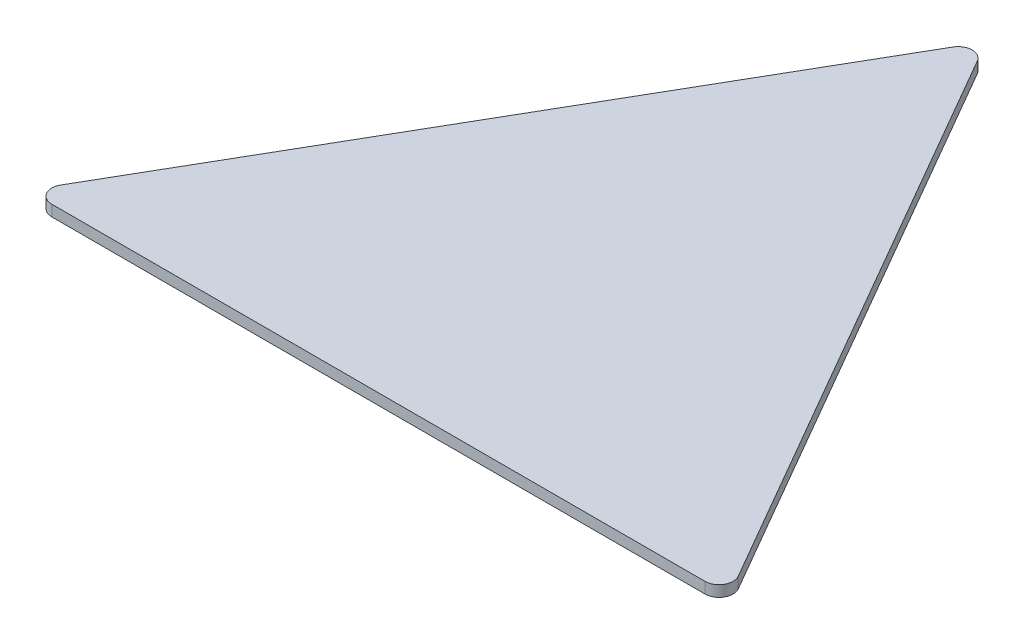
ISO-10303-21;
HEADER;
FILE_DESCRIPTION(('STEP AP214'),'2;1');
FILE_NAME('part.step','',(''),(''),'','','');
FILE_SCHEMA(('AUTOMOTIVE_DESIGN { 1 0 10303 214 1 1 1 1 }'));
ENDSEC;
DATA;
#1=APPLICATION_CONTEXT('core data for automotive mechanical design processes');
#2=APPLICATION_PROTOCOL_DEFINITION('international standard','automotive_design',2000,#1);
#3=PRODUCT_CONTEXT('',#1,'mechanical');
#4=PRODUCT('Part','Part','',(#3));
#5=PRODUCT_RELATED_PRODUCT_CATEGORY('part','',(#4));
#6=PRODUCT_DEFINITION_FORMATION('','',#4);
#7=PRODUCT_DEFINITION_CONTEXT('part definition',#1,'design');
#8=PRODUCT_DEFINITION('design','',#6,#7);
#9=PRODUCT_DEFINITION_SHAPE('','',#8);
#10=(LENGTH_UNIT() NAMED_UNIT(*) SI_UNIT(.MILLI.,.METRE.));
#11=(NAMED_UNIT(*) PLANE_ANGLE_UNIT() SI_UNIT($,.RADIAN.));
#12=(NAMED_UNIT(*) SI_UNIT($,.STERADIAN.) SOLID_ANGLE_UNIT());
#13=UNCERTAINTY_MEASURE_WITH_UNIT(LENGTH_MEASURE(1.E-05),#10,'distance_accuracy_value','');
#14=(GEOMETRIC_REPRESENTATION_CONTEXT(3) GLOBAL_UNCERTAINTY_ASSIGNED_CONTEXT((#13)) GLOBAL_UNIT_ASSIGNED_CONTEXT((#10,
#11,#12)) REPRESENTATION_CONTEXT('',''));
#15=CARTESIAN_POINT('',(0.,0.,0.));
#16=DIRECTION('',(0.,0.,1.));
#17=DIRECTION('',(1.,0.,0.));
#18=AXIS2_PLACEMENT_3D('',#15,#16,#17);
#19=CARTESIAN_POINT('',(127.,3.9878,73.3234841870824));
#20=DIRECTION('',(-0.866025403784439,0.,0.5));
#21=DIRECTION('',(0.5,0.,0.866025403784439));
#22=AXIS2_PLACEMENT_3D('',#19,#20,#21);
#23=PLANE('',#22);
#24=DIRECTION('',(-0.5,0.,-0.866025403784439));
#25=VECTOR('',#24,1.);
#26=CARTESIAN_POINT('',(127.,0.,73.3234841870824));
#27=LINE('',#26,#25);
#28=CARTESIAN_POINT('',(122.600590948775,0.,65.7034841870824));
#29=VERTEX_POINT('',#28);
#30=CARTESIAN_POINT('',(4.39940905122493,0.,-139.026968374165));
#31=VERTEX_POINT('',#30);
#32=EDGE_CURVE('E116',#29,#31,#27,.T.);
#33=ORIENTED_EDGE('',*,*,#32,.T.);
#34=DIRECTION('',(0.,-1.,0.));
#35=VECTOR('',#34,1.);
#36=CARTESIAN_POINT('',(4.39940905122495,3.9878,-139.026968374165));
#37=LINE('',#36,#35);
#38=CARTESIAN_POINT('',(4.39940905122493,3.9878,-139.026968374165));
#39=VERTEX_POINT('',#38);
#40=EDGE_CURVE('E11',#31,#39,#37,.F.);
#41=ORIENTED_EDGE('',*,*,#40,.T.);
#42=DIRECTION('',(-0.5,0.,-0.866025403784439));
#43=VECTOR('',#42,1.);
#44=CARTESIAN_POINT('',(127.,3.9878,73.3234841870824));
#45=LINE('',#44,#43);
#46=CARTESIAN_POINT('',(122.600590948775,3.9878,65.7034841870824));
#47=VERTEX_POINT('',#46);
#48=EDGE_CURVE('E111',#47,#39,#45,.T.);
#49=ORIENTED_EDGE('',*,*,#48,.F.);
#50=DIRECTION('',(0.,-1.,0.));
#51=VECTOR('',#50,1.);
#52=CARTESIAN_POINT('',(122.600590948775,3.9878,65.7034841870824));
#53=LINE('',#52,#51);
#54=EDGE_CURVE('E41',#47,#29,#53,.T.);
#55=ORIENTED_EDGE('',*,*,#54,.T.);
#56=EDGE_LOOP('',(#33,#41,#49,#55));
#57=FACE_BOUND('',#56,.T.);
#58=ADVANCED_FACE('F33',(#57),#23,.F.);
#59=CARTESIAN_POINT('',(0.,3.9878,-146.646968374165));
#60=DIRECTION('',(0.866025403784438,0.,0.5));
#61=DIRECTION('',(0.5,0.,-0.866025403784439));
#62=AXIS2_PLACEMENT_3D('',#59,#60,#61);
#63=PLANE('',#62);
#64=DIRECTION('',(-0.5,0.,0.866025403784439));
#65=VECTOR('',#64,1.);
#66=CARTESIAN_POINT('',(0.,0.,-146.646968374165));
#67=LINE('',#66,#65);
#68=CARTESIAN_POINT('',(-4.39940905122494,0.,-139.026968374165));
#69=VERTEX_POINT('',#68);
#70=CARTESIAN_POINT('',(-122.600590948775,0.,65.7034841870826));
#71=VERTEX_POINT('',#70);
#72=EDGE_CURVE('E112',#69,#71,#67,.T.);
#73=ORIENTED_EDGE('',*,*,#72,.T.);
#74=DIRECTION('',(0.,-1.,0.));
#75=VECTOR('',#74,1.);
#76=CARTESIAN_POINT('',(-122.600590948775,3.9878,65.7034841870825));
#77=LINE('',#76,#75);
#78=CARTESIAN_POINT('',(-122.600590948775,3.9878,65.7034841870826));
#79=VERTEX_POINT('',#78);
#80=EDGE_CURVE('E91',#71,#79,#77,.F.);
#81=ORIENTED_EDGE('',*,*,#80,.T.);
#82=DIRECTION('',(-0.5,0.,0.866025403784439));
#83=VECTOR('',#82,1.);
#84=CARTESIAN_POINT('',(0.,3.9878,-146.646968374165));
#85=LINE('',#84,#83);
#86=CARTESIAN_POINT('',(-4.39940905122494,3.9878,-139.026968374165));
#87=VERTEX_POINT('',#86);
#88=EDGE_CURVE('E114',#87,#79,#85,.T.);
#89=ORIENTED_EDGE('',*,*,#88,.F.);
#90=DIRECTION('',(0.,-1.,0.));
#91=VECTOR('',#90,1.);
#92=CARTESIAN_POINT('',(-4.39940905122494,3.9878,-139.026968374165));
#93=LINE('',#92,#91);
#94=EDGE_CURVE('E96',#87,#69,#93,.T.);
#95=ORIENTED_EDGE('',*,*,#94,.T.);
#96=EDGE_LOOP('',(#73,#81,#89,#95));
#97=FACE_BOUND('',#96,.T.);
#98=ADVANCED_FACE('F141',(#97),#63,.F.);
#99=CARTESIAN_POINT('',(-127.,3.9878,73.3234841870825));
#100=DIRECTION('',(0.,0.,-1.));
#101=DIRECTION('',(-1.,0.,0.));
#102=AXIS2_PLACEMENT_3D('',#99,#100,#101);
#103=PLANE('',#102);
#104=DIRECTION('',(1.,0.,0.));
#105=VECTOR('',#104,1.);
#106=CARTESIAN_POINT('',(-127.,3.9878,73.3234841870825));
#107=LINE('',#106,#105);
#108=CARTESIAN_POINT('',(-118.20118189755,3.9878,73.3234841870825));
#109=VERTEX_POINT('',#108);
#110=CARTESIAN_POINT('',(118.20118189755,3.9878,73.3234841870824));
#111=VERTEX_POINT('',#110);
#112=EDGE_CURVE('E105',#109,#111,#107,.T.);
#113=ORIENTED_EDGE('',*,*,#112,.F.);
#114=DIRECTION('',(0.,-1.,0.));
#115=VECTOR('',#114,1.);
#116=CARTESIAN_POINT('',(-118.20118189755,3.9878,73.3234841870825));
#117=LINE('',#116,#115);
#118=CARTESIAN_POINT('',(-118.20118189755,0.,73.3234841870825));
#119=VERTEX_POINT('',#118);
#120=EDGE_CURVE('E90',#109,#119,#117,.T.);
#121=ORIENTED_EDGE('',*,*,#120,.T.);
#122=DIRECTION('',(1.,0.,0.));
#123=VECTOR('',#122,1.);
#124=CARTESIAN_POINT('',(-127.,0.,73.3234841870825));
#125=LINE('',#124,#123);
#126=CARTESIAN_POINT('',(118.20118189755,0.,73.3234841870824));
#127=VERTEX_POINT('',#126);
#128=EDGE_CURVE('E103',#119,#127,#125,.T.);
#129=ORIENTED_EDGE('',*,*,#128,.T.);
#130=DIRECTION('',(0.,-1.,0.));
#131=VECTOR('',#130,1.);
#132=CARTESIAN_POINT('',(118.20118189755,3.9878,73.3234841870824));
#133=LINE('',#132,#131);
#134=EDGE_CURVE('E107',#127,#111,#133,.F.);
#135=ORIENTED_EDGE('',*,*,#134,.T.);
#136=EDGE_LOOP('',(#113,#121,#129,#135));
#137=FACE_BOUND('',#136,.T.);
#138=ADVANCED_FACE('F102',(#137),#103,.F.);
#139=CARTESIAN_POINT('',(0.,3.9878,0.));
#140=DIRECTION('',(0.,1.,0.));
#141=DIRECTION('',(0.,0.,1.));
#142=AXIS2_PLACEMENT_3D('',#139,#140,#141);
#143=PLANE('',#142);
#144=ORIENTED_EDGE('',*,*,#88,.T.);
#145=CARTESIAN_POINT('',(-118.20118189755,3.9878,68.2434841870825));
#146=DIRECTION('',(0.,1.,0.));
#147=DIRECTION('',(0.,0.,1.));
#148=AXIS2_PLACEMENT_3D('',#145,#146,#147);
#149=CIRCLE('',#148,5.08);
#150=EDGE_CURVE('E129',#79,#109,#149,.T.);
#151=ORIENTED_EDGE('',*,*,#150,.T.);
#152=ORIENTED_EDGE('',*,*,#112,.T.);
#153=CARTESIAN_POINT('',(118.20118189755,3.9878,68.2434841870824));
#154=DIRECTION('',(0.,1.,0.));
#155=DIRECTION('',(0.,0.,1.));
#156=AXIS2_PLACEMENT_3D('',#153,#154,#155);
#157=CIRCLE('',#156,5.08);
#158=EDGE_CURVE('E53',#111,#47,#157,.T.);
#159=ORIENTED_EDGE('',*,*,#158,.T.);
#160=ORIENTED_EDGE('',*,*,#48,.T.);
#161=CARTESIAN_POINT('',(0.,3.9878,-136.486968374165));
#162=DIRECTION('',(0.,1.,0.));
#163=DIRECTION('',(0.,0.,1.));
#164=AXIS2_PLACEMENT_3D('',#161,#162,#163);
#165=CIRCLE('',#164,5.08);
#166=EDGE_CURVE('E127',#39,#87,#165,.T.);
#167=ORIENTED_EDGE('',*,*,#166,.T.);
#168=EDGE_LOOP('',(#144,#151,#152,#159,#160,#167));
#169=FACE_BOUND('',#168,.T.);
#170=ADVANCED_FACE('F137',(#169),#143,.T.);
#171=CARTESIAN_POINT('',(0.,0.,0.));
#172=DIRECTION('',(0.,1.,0.));
#173=DIRECTION('',(0.,0.,1.));
#174=AXIS2_PLACEMENT_3D('',#171,#172,#173);
#175=PLANE('',#174);
#176=ORIENTED_EDGE('',*,*,#128,.F.);
#177=CARTESIAN_POINT('',(-118.20118189755,0.,68.2434841870825));
#178=DIRECTION('',(0.,1.,0.));
#179=DIRECTION('',(0.,0.,1.));
#180=AXIS2_PLACEMENT_3D('',#177,#178,#179);
#181=CIRCLE('',#180,5.08);
#182=EDGE_CURVE('E86',#119,#71,#181,.F.);
#183=ORIENTED_EDGE('',*,*,#182,.T.);
#184=ORIENTED_EDGE('',*,*,#72,.F.);
#185=CARTESIAN_POINT('',(0.,0.,-136.486968374165));
#186=DIRECTION('',(0.,1.,0.));
#187=DIRECTION('',(0.,0.,1.));
#188=AXIS2_PLACEMENT_3D('',#185,#186,#187);
#189=CIRCLE('',#188,5.08);
#190=EDGE_CURVE('E97',#69,#31,#189,.F.);
#191=ORIENTED_EDGE('',*,*,#190,.T.);
#192=ORIENTED_EDGE('',*,*,#32,.F.);
#193=CARTESIAN_POINT('',(118.20118189755,0.,68.2434841870824));
#194=DIRECTION('',(0.,1.,0.));
#195=DIRECTION('',(0.,0.,1.));
#196=AXIS2_PLACEMENT_3D('',#193,#194,#195);
#197=CIRCLE('',#196,5.08);
#198=EDGE_CURVE('E106',#29,#127,#197,.F.);
#199=ORIENTED_EDGE('',*,*,#198,.T.);
#200=EDGE_LOOP('',(#176,#183,#184,#191,#192,#199));
#201=FACE_BOUND('',#200,.T.);
#202=ADVANCED_FACE('F109',(#201),#175,.F.);
#203=CARTESIAN_POINT('',(-118.20118189755,3.9878,68.2434841870825));
#204=DIRECTION('',(0.,-1.,0.));
#205=DIRECTION('',(0.,0.,-1.));
#206=AXIS2_PLACEMENT_3D('',#203,#204,#205);
#207=CYLINDRICAL_SURFACE('',#206,5.08);
#208=ORIENTED_EDGE('',*,*,#150,.F.);
#209=ORIENTED_EDGE('',*,*,#80,.F.);
#210=ORIENTED_EDGE('',*,*,#182,.F.);
#211=ORIENTED_EDGE('',*,*,#120,.F.);
#212=EDGE_LOOP('',(#208,#209,#210,#211));
#213=FACE_BOUND('',#212,.T.);
#214=ADVANCED_FACE('F89',(#213),#207,.T.);
#215=CARTESIAN_POINT('',(0.,3.9878,-136.486968374165));
#216=DIRECTION('',(0.,-1.,0.));
#217=DIRECTION('',(0.,0.,-1.));
#218=AXIS2_PLACEMENT_3D('',#215,#216,#217);
#219=CYLINDRICAL_SURFACE('',#218,5.08);
#220=ORIENTED_EDGE('',*,*,#166,.F.);
#221=ORIENTED_EDGE('',*,*,#40,.F.);
#222=ORIENTED_EDGE('',*,*,#190,.F.);
#223=ORIENTED_EDGE('',*,*,#94,.F.);
#224=EDGE_LOOP('',(#220,#221,#222,#223));
#225=FACE_BOUND('',#224,.T.);
#226=ADVANCED_FACE('F143',(#225),#219,.T.);
#227=CARTESIAN_POINT('',(118.20118189755,3.9878,68.2434841870824));
#228=DIRECTION('',(0.,-1.,0.));
#229=DIRECTION('',(0.,0.,-1.));
#230=AXIS2_PLACEMENT_3D('',#227,#228,#229);
#231=CYLINDRICAL_SURFACE('',#230,5.08);
#232=ORIENTED_EDGE('',*,*,#158,.F.);
#233=ORIENTED_EDGE('',*,*,#134,.F.);
#234=ORIENTED_EDGE('',*,*,#198,.F.);
#235=ORIENTED_EDGE('',*,*,#54,.F.);
#236=EDGE_LOOP('',(#232,#233,#234,#235));
#237=FACE_BOUND('',#236,.T.);
#238=ADVANCED_FACE('F35',(#237),#231,.T.);
#239=CLOSED_SHELL('',(#58,#98,#138,#170,#202,#214,#226,#238));
#240=MANIFOLD_SOLID_BREP('B2',#239);
#241=ADVANCED_BREP_SHAPE_REPRESENTATION('',(#18,#240),#14);
#242=SHAPE_DEFINITION_REPRESENTATION(#9,#241);
ENDSEC;
END-ISO-10303-21;
